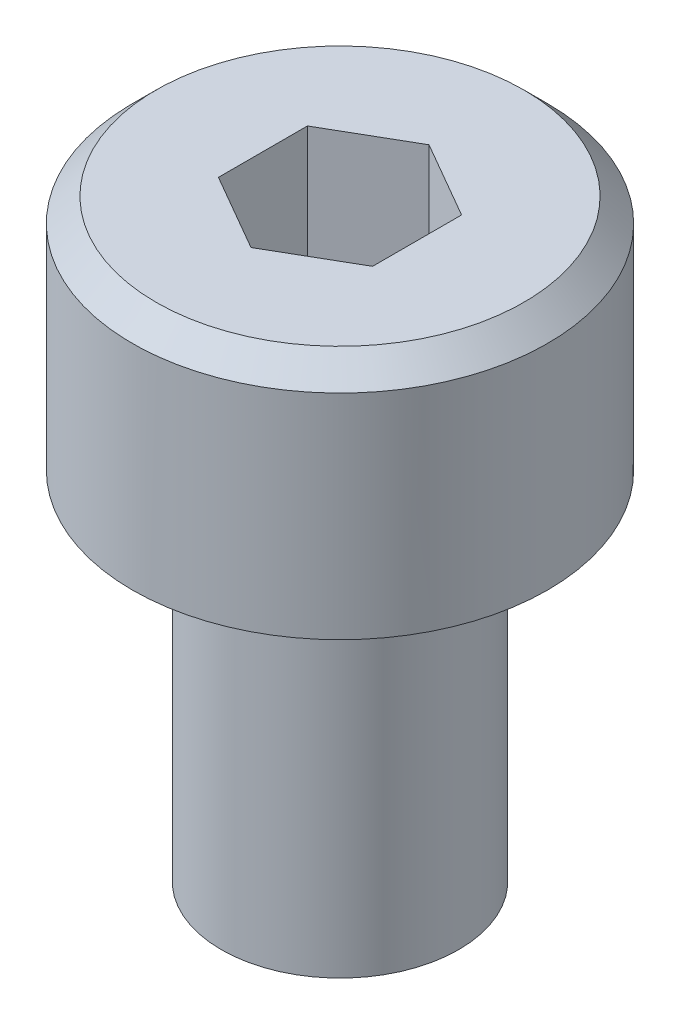
ISO-10303-21;
HEADER;
FILE_DESCRIPTION(('STEP AP214'),'2;1');
FILE_NAME('part.step','',(''),(''),'','','');
FILE_SCHEMA(('AUTOMOTIVE_DESIGN { 1 0 10303 214 1 1 1 1 }'));
ENDSEC;
DATA;
#1=APPLICATION_CONTEXT('core data for automotive mechanical design processes');
#2=APPLICATION_PROTOCOL_DEFINITION('international standard','automotive_design',2000,#1);
#3=PRODUCT_CONTEXT('',#1,'mechanical');
#4=PRODUCT('Part','Part','',(#3));
#5=PRODUCT_RELATED_PRODUCT_CATEGORY('part','',(#4));
#6=PRODUCT_DEFINITION_FORMATION('','',#4);
#7=PRODUCT_DEFINITION_CONTEXT('part definition',#1,'design');
#8=PRODUCT_DEFINITION('design','',#6,#7);
#9=PRODUCT_DEFINITION_SHAPE('','',#8);
#10=(LENGTH_UNIT() NAMED_UNIT(*) SI_UNIT(.MILLI.,.METRE.));
#11=(NAMED_UNIT(*) PLANE_ANGLE_UNIT() SI_UNIT($,.RADIAN.));
#12=(NAMED_UNIT(*) SI_UNIT($,.STERADIAN.) SOLID_ANGLE_UNIT());
#13=UNCERTAINTY_MEASURE_WITH_UNIT(LENGTH_MEASURE(1.E-05),#10,'distance_accuracy_value','');
#14=(GEOMETRIC_REPRESENTATION_CONTEXT(3) GLOBAL_UNCERTAINTY_ASSIGNED_CONTEXT((#13)) GLOBAL_UNIT_ASSIGNED_CONTEXT((#10,
#11,#12)) REPRESENTATION_CONTEXT('',''));
#15=CARTESIAN_POINT('',(0.,0.,0.));
#16=DIRECTION('',(0.,0.,1.));
#17=DIRECTION('',(1.,0.,0.));
#18=AXIS2_PLACEMENT_3D('',#15,#16,#17);
#19=CARTESIAN_POINT('',(0.,0.,0.));
#20=DIRECTION('',(0.,1.,0.));
#21=DIRECTION('',(0.,0.,1.));
#22=AXIS2_PLACEMENT_3D('',#19,#20,#21);
#23=PLANE('',#22);
#24=CARTESIAN_POINT('',(0.,0.,0.));
#25=DIRECTION('',(0.,1.,0.));
#26=DIRECTION('',(0.,0.,1.));
#27=AXIS2_PLACEMENT_3D('',#24,#25,#26);
#28=CIRCLE('',#27,3.5);
#29=CARTESIAN_POINT('',(0.,0.,3.5));
#30=VERTEX_POINT('',#29);
#31=EDGE_CURVE('E192',#30,#30,#28,.T.);
#32=ORIENTED_EDGE('',*,*,#31,.F.);
#33=EDGE_LOOP('',(#32));
#34=FACE_BOUND('',#33,.T.);
#35=CARTESIAN_POINT('',(0.,0.,0.));
#36=DIRECTION('',(0.,1.,0.));
#37=DIRECTION('',(0.,0.,1.));
#38=AXIS2_PLACEMENT_3D('',#35,#36,#37);
#39=CIRCLE('',#38,2.);
#40=CARTESIAN_POINT('',(0.,0.,2.));
#41=VERTEX_POINT('',#40);
#42=EDGE_CURVE('E11',#41,#41,#39,.F.);
#43=ORIENTED_EDGE('',*,*,#42,.F.);
#44=EDGE_LOOP('',(#43));
#45=FACE_BOUND('',#44,.T.);
#46=ADVANCED_FACE('F32',(#34,#45),#23,.F.);
#47=CARTESIAN_POINT('',(0.,4.,0.));
#48=DIRECTION('',(0.,1.,0.));
#49=DIRECTION('',(0.,0.,1.));
#50=AXIS2_PLACEMENT_3D('',#47,#48,#49);
#51=PLANE('',#50);
#52=CARTESIAN_POINT('',(0.,4.,0.));
#53=DIRECTION('',(0.,1.,0.));
#54=DIRECTION('',(0.,0.,1.));
#55=AXIS2_PLACEMENT_3D('',#52,#53,#54);
#56=CIRCLE('',#55,3.1);
#57=CARTESIAN_POINT('',(0.,4.,-3.1));
#58=VERTEX_POINT('',#57);
#59=EDGE_CURVE('E105',#58,#58,#56,.T.);
#60=ORIENTED_EDGE('',*,*,#59,.T.);
#61=EDGE_LOOP('',(#60));
#62=FACE_BOUND('',#61,.T.);
#63=DIRECTION('',(-0.866025403784439,0.,0.5));
#64=VECTOR('',#63,1.);
#65=CARTESIAN_POINT('',(0.,4.,-1.5));
#66=LINE('',#65,#64);
#67=CARTESIAN_POINT('',(0.,4.,-1.5));
#68=VERTEX_POINT('',#67);
#69=CARTESIAN_POINT('',(-1.29903810567666,4.,-0.75));
#70=VERTEX_POINT('',#69);
#71=EDGE_CURVE('E168',#68,#70,#66,.T.);
#72=ORIENTED_EDGE('',*,*,#71,.F.);
#73=DIRECTION('',(-0.866025403784439,0.,-0.5));
#74=VECTOR('',#73,1.);
#75=CARTESIAN_POINT('',(1.29903810567666,4.,-0.750000000000001));
#76=LINE('',#75,#74);
#77=CARTESIAN_POINT('',(1.29903810567666,4.,-0.750000000000001));
#78=VERTEX_POINT('',#77);
#79=EDGE_CURVE('E166',#78,#68,#76,.T.);
#80=ORIENTED_EDGE('',*,*,#79,.F.);
#81=DIRECTION('',(0.,0.,-1.));
#82=VECTOR('',#81,1.);
#83=CARTESIAN_POINT('',(1.29903810567666,4.,0.75));
#84=LINE('',#83,#82);
#85=CARTESIAN_POINT('',(1.29903810567666,4.,0.75));
#86=VERTEX_POINT('',#85);
#87=EDGE_CURVE('E177',#86,#78,#84,.T.);
#88=ORIENTED_EDGE('',*,*,#87,.F.);
#89=DIRECTION('',(0.866025403784439,0.,-0.5));
#90=VECTOR('',#89,1.);
#91=CARTESIAN_POINT('',(0.,4.,1.5));
#92=LINE('',#91,#90);
#93=CARTESIAN_POINT('',(0.,4.,1.5));
#94=VERTEX_POINT('',#93);
#95=EDGE_CURVE('E174',#94,#86,#92,.T.);
#96=ORIENTED_EDGE('',*,*,#95,.F.);
#97=DIRECTION('',(0.866025403784439,0.,0.5));
#98=VECTOR('',#97,1.);
#99=CARTESIAN_POINT('',(-1.29903810567666,4.,0.75));
#100=LINE('',#99,#98);
#101=CARTESIAN_POINT('',(-1.29903810567666,4.,0.75));
#102=VERTEX_POINT('',#101);
#103=EDGE_CURVE('E172',#102,#94,#100,.T.);
#104=ORIENTED_EDGE('',*,*,#103,.F.);
#105=DIRECTION('',(0.,0.,1.));
#106=VECTOR('',#105,1.);
#107=CARTESIAN_POINT('',(-1.29903810567666,4.,-0.75));
#108=LINE('',#107,#106);
#109=EDGE_CURVE('E170',#70,#102,#108,.T.);
#110=ORIENTED_EDGE('',*,*,#109,.F.);
#111=EDGE_LOOP('',(#72,#80,#88,#96,#104,#110));
#112=FACE_BOUND('',#111,.T.);
#113=ADVANCED_FACE('F160',(#62,#112),#51,.T.);
#114=CARTESIAN_POINT('',(0.,4.,0.));
#115=DIRECTION('',(0.,-1.,0.));
#116=DIRECTION('',(0.,0.,-1.));
#117=AXIS2_PLACEMENT_3D('',#114,#115,#116);
#118=CYLINDRICAL_SURFACE('',#117,3.5);
#119=CARTESIAN_POINT('',(0.,3.6,0.));
#120=DIRECTION('',(0.,1.,0.));
#121=DIRECTION('',(0.,0.,1.));
#122=AXIS2_PLACEMENT_3D('',#119,#120,#121);
#123=CIRCLE('',#122,3.5);
#124=CARTESIAN_POINT('',(0.,3.6,-3.5));
#125=VERTEX_POINT('',#124);
#126=EDGE_CURVE('E103',#125,#125,#123,.F.);
#127=ORIENTED_EDGE('',*,*,#126,.T.);
#128=EDGE_LOOP('',(#127));
#129=FACE_BOUND('',#128,.T.);
#130=ORIENTED_EDGE('',*,*,#31,.T.);
#131=EDGE_LOOP('',(#130));
#132=FACE_BOUND('',#131,.T.);
#133=ADVANCED_FACE('F158',(#129,#132),#118,.T.);
#134=CARTESIAN_POINT('',(1.29903810567666,4.,-0.750000000000001));
#135=DIRECTION('',(-0.5,0.,0.866025403784439));
#136=DIRECTION('',(0.866025403784439,0.,0.5));
#137=AXIS2_PLACEMENT_3D('',#134,#135,#136);
#138=PLANE('',#137);
#139=CARTESIAN_POINT('',(1.29923810567666,2.00006667436408,-0.749884529946163));
#140=CARTESIAN_POINT('',(1.24214987270278,1.98102739698028,-0.78284443662119));
#141=CARTESIAN_POINT('',(1.18456886238507,1.96371133437114,-0.816088848428332));
#142=CARTESIAN_POINT('',(1.06840958998256,1.93348474770639,-0.883153435618794));
#143=CARTESIAN_POINT('',(1.00982926260591,1.92058491882438,-0.916974803398919));
#144=CARTESIAN_POINT('',(0.893394665878013,1.90050277895804,-0.984198349162754));
#145=CARTESIAN_POINT('',(0.835558320207964,1.89318683914949,-1.0175901789043));
#146=CARTESIAN_POINT('',(0.719613235026872,1.8844502272376,-1.08453110504482));
#147=CARTESIAN_POINT('',(0.661504917460321,1.88302232353665,-1.11807995783402));
#148=CARTESIAN_POINT('',(0.552909399162213,1.88597941688018,-1.18077760955622));
#149=CARTESIAN_POINT('',(0.502406011990167,1.88963834315006,-1.20993575373499));
#150=CARTESIAN_POINT('',(0.401728295544788,1.90123916970559,-1.26806206042613));
#151=CARTESIAN_POINT('',(0.351554314972344,1.90918503984658,-1.29703002161594));
#152=CARTESIAN_POINT('',(0.250668712309326,1.92905074406248,-1.35527635147079));
#153=CARTESIAN_POINT('',(0.199969870837079,1.94105485948197,-1.3845473412424));
#154=CARTESIAN_POINT('',(0.0993287188256888,1.96830011157965,-1.44265253744773));
#155=CARTESIAN_POINT('',(0.049385117088889,1.98353483895623,-1.47148748935477));
#156=CARTESIAN_POINT('',(-0.000199999999999955,2.00006667436408,-1.50011547005384));
#157=B_SPLINE_CURVE_WITH_KNOTS('',3,(#139,#140,#141,#142,#143,#144,#145,#146,#147,#148,#149,
#150,#151,#152,#153,#154,#155,#156),.UNSPECIFIED.,.F.,.F.,(4,2,2,2,2,2,2,2,4),(0.,
0.205923753300298,0.412342739320073,0.613651952864191,0.814713847677287,0.989839927834408,
1.1651284597321,1.34430720566629,1.5231337451063),.UNSPECIFIED.);
#158=CARTESIAN_POINT('',(1.29903810567666,2.,-0.75));
#159=VERTEX_POINT('',#158);
#160=CARTESIAN_POINT('',(0.,2.,-1.5));
#161=VERTEX_POINT('',#160);
#162=EDGE_CURVE('E98',#159,#161,#157,.T.);
#163=ORIENTED_EDGE('',*,*,#162,.F.);
#164=DIRECTION('',(0.,-1.,0.));
#165=VECTOR('',#164,1.);
#166=CARTESIAN_POINT('',(1.29903810567666,4.,-0.750000000000001));
#167=LINE('',#166,#165);
#168=EDGE_CURVE('E179',#78,#159,#167,.T.);
#169=ORIENTED_EDGE('',*,*,#168,.F.);
#170=ORIENTED_EDGE('',*,*,#79,.T.);
#171=DIRECTION('',(0.,-1.,0.));
#172=VECTOR('',#171,1.);
#173=CARTESIAN_POINT('',(0.,4.,-1.5));
#174=LINE('',#173,#172);
#175=EDGE_CURVE('E190',#68,#161,#174,.T.);
#176=ORIENTED_EDGE('',*,*,#175,.T.);
#177=EDGE_LOOP('',(#163,#169,#170,#176));
#178=FACE_BOUND('',#177,.T.);
#179=ADVANCED_FACE('F154',(#178),#138,.T.);
#180=CARTESIAN_POINT('',(0.,4.,-1.5));
#181=DIRECTION('',(0.5,0.,0.866025403784439));
#182=DIRECTION('',(0.866025403784439,0.,-0.5));
#183=AXIS2_PLACEMENT_3D('',#180,#181,#182);
#184=PLANE('',#183);
#185=CARTESIAN_POINT('',(0.00019999999999992,2.00006667436408,-1.50011547005384));
#186=CARTESIAN_POINT('',(-0.0568882329738765,1.98102739698028,-1.46715556337881));
#187=CARTESIAN_POINT('',(-0.114469243291589,1.96371133437114,-1.43391115157167));
#188=CARTESIAN_POINT('',(-0.230628515694101,1.93348474770639,-1.36684656438121));
#189=CARTESIAN_POINT('',(-0.289208843070752,1.92058491882438,-1.33302519660108));
#190=CARTESIAN_POINT('',(-0.405643439798644,1.90050277895804,-1.26580165083725));
#191=CARTESIAN_POINT('',(-0.463479785468694,1.89318683914949,-1.2324098210957));
#192=CARTESIAN_POINT('',(-0.579424870649785,1.8844502272376,-1.16546889495518));
#193=CARTESIAN_POINT('',(-0.637533188216337,1.88302232353665,-1.13192004216598));
#194=CARTESIAN_POINT('',(-0.746128706514445,1.88597941688018,-1.06922239044378));
#195=CARTESIAN_POINT('',(-0.79663209368649,1.88963834315006,-1.04006424626501));
#196=CARTESIAN_POINT('',(-0.89730981013187,1.90123916970559,-0.981937939573873));
#197=CARTESIAN_POINT('',(-0.947483790704314,1.90918503984658,-0.952969978384058));
#198=CARTESIAN_POINT('',(-1.04836939336733,1.92905074406248,-0.894723648529207));
#199=CARTESIAN_POINT('',(-1.09906823483958,1.94105485948197,-0.865452658757603));
#200=CARTESIAN_POINT('',(-1.19970938685097,1.96830011157965,-0.807347462552272));
#201=CARTESIAN_POINT('',(-1.24965298858777,1.98353483895623,-0.778512510645232));
#202=CARTESIAN_POINT('',(-1.29923810567666,2.00006667436408,-0.749884529946162));
#203=B_SPLINE_CURVE_WITH_KNOTS('',3,(#185,#186,#187,#188,#189,#190,#191,#192,#193,#194,#195,
#196,#197,#198,#199,#200,#201,#202),.UNSPECIFIED.,.F.,.F.,(4,2,2,2,2,2,2,2,4),(0.,
0.205923753300298,0.412342739320073,0.613651952864191,0.814713847677287,0.989839927834407,
1.1651284597321,1.34430720566629,1.5231337451063),.UNSPECIFIED.);
#204=CARTESIAN_POINT('',(-1.29903810567666,2.,-0.75));
#205=VERTEX_POINT('',#204);
#206=EDGE_CURVE('E47',#161,#205,#203,.T.);
#207=ORIENTED_EDGE('',*,*,#206,.F.);
#208=ORIENTED_EDGE('',*,*,#175,.F.);
#209=ORIENTED_EDGE('',*,*,#71,.T.);
#210=DIRECTION('',(0.,-1.,0.));
#211=VECTOR('',#210,1.);
#212=CARTESIAN_POINT('',(-1.29903810567666,4.,-0.75));
#213=LINE('',#212,#211);
#214=EDGE_CURVE('E188',#70,#205,#213,.T.);
#215=ORIENTED_EDGE('',*,*,#214,.T.);
#216=EDGE_LOOP('',(#207,#208,#209,#215));
#217=FACE_BOUND('',#216,.T.);
#218=ADVANCED_FACE('F150',(#217),#184,.T.);
#219=CARTESIAN_POINT('',(-1.29903810567666,4.,-0.75));
#220=DIRECTION('',(1.,0.,0.));
#221=DIRECTION('',(0.,0.,-1.));
#222=AXIS2_PLACEMENT_3D('',#219,#220,#221);
#223=PLANE('',#222);
#224=CARTESIAN_POINT('',(-1.29903810567666,2.4830282094431,-1.94225048695755));
#225=CARTESIAN_POINT('',(-1.29903810567666,2.45611497443675,-1.88615347064013));
#226=CARTESIAN_POINT('',(-1.29903810567666,2.42948135054686,-1.82991990971891));
#227=CARTESIAN_POINT('',(-1.29903810567666,2.37693176598375,-1.71710663219018));
#228=CARTESIAN_POINT('',(-1.29903810567666,2.35101593446546,-1.66052685549438));
#229=CARTESIAN_POINT('',(-1.29903810567666,2.29991559584203,-1.54662366716242));
#230=CARTESIAN_POINT('',(-1.29903810567666,2.27473647859602,-1.48929782656429));
#231=CARTESIAN_POINT('',(-1.29903810567666,2.2255078925688,-1.37416603649638));
#232=CARTESIAN_POINT('',(-1.29903810567666,2.20145836505076,-1.31636011217452));
#233=CARTESIAN_POINT('',(-1.29903810567666,2.15417463668968,-1.19864930460941));
#234=CARTESIAN_POINT('',(-1.29903810567666,2.13097818335424,-1.13872905416261));
#235=CARTESIAN_POINT('',(-1.29903810567666,2.08652162979831,-1.01817680082139));
#236=CARTESIAN_POINT('',(-1.29903810567666,2.06526177221582,-0.957544709811161));
#237=CARTESIAN_POINT('',(-1.29903810567666,2.00528369487247,-0.774679321912285));
#238=CARTESIAN_POINT('',(-1.29903810567666,1.97022627007519,-0.651142266759561));
#239=CARTESIAN_POINT('',(-1.29903810567666,1.92956138055463,-0.463364900845992));
#240=CARTESIAN_POINT('',(-1.29903810567666,1.91799854238455,-0.400420390287828));
#241=CARTESIAN_POINT('',(-1.29903810567666,1.89963928010999,-0.273823298675913));
#242=CARTESIAN_POINT('',(-1.29903810567666,1.89284253390381,-0.210170765767089));
#243=CARTESIAN_POINT('',(-1.29903810567666,1.88464414943077,-0.0832760814164118));
#244=CARTESIAN_POINT('',(-1.29903810567666,1.88317884506845,-0.0200381507832169));
#245=CARTESIAN_POINT('',(-1.29903810567666,1.88559754660934,0.106333266063468));
#246=CARTESIAN_POINT('',(-1.29903810567666,1.88948188374344,0.169466745567383));
#247=CARTESIAN_POINT('',(-1.29903810567666,1.90532405359351,0.325239234546665));
#248=CARTESIAN_POINT('',(-1.29903810567666,1.92025075011812,0.417576377050972));
#249=CARTESIAN_POINT('',(-1.29903810567666,1.95874239355456,0.600455056286723));
#250=CARTESIAN_POINT('',(-1.29903810567666,1.98231775163072,0.690994289665581));
#251=CARTESIAN_POINT('',(-1.29903810567666,2.02259022438996,0.82640566883731));
#252=CARTESIAN_POINT('',(-1.29903810567666,2.0370204504804,0.871977772356621));
#253=CARTESIAN_POINT('',(-1.29903810567666,2.06721578122061,0.96264760340618));
#254=CARTESIAN_POINT('',(-1.29903810567666,2.08298005280305,1.00774560749938));
#255=CARTESIAN_POINT('',(-1.29903810567666,2.11561453093579,1.09752750677854));
#256=CARTESIAN_POINT('',(-1.29903810567666,2.13248453649953,1.14221147554661));
#257=CARTESIAN_POINT('',(-1.29903810567666,2.16714800641459,1.23122731862912));
#258=CARTESIAN_POINT('',(-1.29903810567666,2.18494162678785,1.27555913198762));
#259=CARTESIAN_POINT('',(-1.29903810567666,2.23150045860955,1.38871805704584));
#260=CARTESIAN_POINT('',(-1.29903810567666,2.26081501435599,1.45731890114295));
#261=CARTESIAN_POINT('',(-1.29903810567666,2.32085725909891,1.59390109839042));
#262=CARTESIAN_POINT('',(-1.29903810567666,2.35158505395942,1.66188240467344));
#263=CARTESIAN_POINT('',(-1.29903810567666,2.44539011368129,1.86510344552369));
#264=CARTESIAN_POINT('',(-1.29903810567666,2.510079436759,1.99959760210747));
#265=CARTESIAN_POINT('',(-1.29903810567666,2.64217114209873,2.26743688758764));
#266=CARTESIAN_POINT('',(-1.29903810567666,2.70957676187852,2.40078040067516));
#267=CARTESIAN_POINT('',(-1.29903810567666,2.84612121611795,2.66655383264073));
#268=CARTESIAN_POINT('',(-1.29903810567666,2.91525983026838,2.79898386494403));
#269=CARTESIAN_POINT('',(-1.29903810567666,3.04814885601528,3.05074184410149));
#270=CARTESIAN_POINT('',(-1.29903810567666,3.11179190110218,3.17012666108495));
#271=CARTESIAN_POINT('',(-1.29903810567666,3.23980313725268,3.40851226994163));
#272=CARTESIAN_POINT('',(-1.29903810567666,3.30417135515214,3.52751304739197));
#273=CARTESIAN_POINT('',(-1.29903810567666,3.43328666949576,3.7649164236608));
#274=CARTESIAN_POINT('',(-1.29903810567666,3.4980323858165,3.88331977408368));
#275=CARTESIAN_POINT('',(-1.29903810567666,3.62794521812164,4.11988709223021));
#276=CARTESIAN_POINT('',(-1.29903810567666,3.69311231187584,4.23805107215707));
#277=CARTESIAN_POINT('',(-1.29903810567666,3.75843392563826,4.35612905173637));
#278=B_SPLINE_CURVE_WITH_KNOTS('',3,(#224,#225,#226,#227,#228,#229,#230,#231,#232,#233,#234,
#235,#236,#237,#238,#239,#240,#241,#242,#243,#244,#245,#246,#247,#248,#249,#250,#251,#252,#253,
#254,#255,#256,#257,#258,#259,#260,#261,#262,#263,#264,#265,#266,#267,#268,#269,#270,#271,#272,
#273,#274,#275,#276,#277),.UNSPECIFIED.,.F.,.F.,(4,2,2,2,2,2,2,2,2,2,2,2,2,2,2,2,2,2,2,2,2,2,2,
2,2,2,4),(0.,0.186659228852257,0.373351828596217,0.561176912269828,0.748992218507678,
0.941717183202198,1.13446626147998,1.51887707501251,1.71072463225552,1.90255922282029,
2.0920953352963,2.28164318370651,2.56167506258581,2.84204515290936,2.98543589028851,
3.12873773647356,3.27201360688425,3.41531375948927,3.63909589056128,3.86289481227248,
4.31056657509818,4.75878868031947,5.20695409084657,5.61281889959598,6.01869877750684,
6.4235462869597,6.82837260973074),.UNSPECIFIED.);
#279=CARTESIAN_POINT('',(-1.29903810567666,2.,0.75));
#280=VERTEX_POINT('',#279);
#281=EDGE_CURVE('E55',#205,#280,#278,.T.);
#282=ORIENTED_EDGE('',*,*,#281,.F.);
#283=ORIENTED_EDGE('',*,*,#214,.F.);
#284=ORIENTED_EDGE('',*,*,#109,.T.);
#285=DIRECTION('',(0.,-1.,0.));
#286=VECTOR('',#285,1.);
#287=CARTESIAN_POINT('',(-1.29903810567666,4.,0.75));
#288=LINE('',#287,#286);
#289=EDGE_CURVE('E186',#102,#280,#288,.T.);
#290=ORIENTED_EDGE('',*,*,#289,.T.);
#291=EDGE_LOOP('',(#282,#283,#284,#290));
#292=FACE_BOUND('',#291,.T.);
#293=ADVANCED_FACE('F147',(#292),#223,.T.);
#294=CARTESIAN_POINT('',(-1.29903810567666,4.,0.75));
#295=DIRECTION('',(0.5,0.,-0.866025403784439));
#296=DIRECTION('',(-0.866025403784439,0.,-0.5));
#297=AXIS2_PLACEMENT_3D('',#294,#295,#296);
#298=PLANE('',#297);
#299=CARTESIAN_POINT('',(-1.29923810567666,2.00006667436408,0.749884529946162));
#300=CARTESIAN_POINT('',(-1.24214987270278,1.98102739698028,0.78284443662119));
#301=CARTESIAN_POINT('',(-1.18456886238507,1.96371133437114,0.816088848428332));
#302=CARTESIAN_POINT('',(-1.06840958998256,1.93348474770639,0.883153435618793));
#303=CARTESIAN_POINT('',(-1.00982926260591,1.92058491882438,0.916974803398919));
#304=CARTESIAN_POINT('',(-0.893394665878014,1.90050277895804,0.984198349162753));
#305=CARTESIAN_POINT('',(-0.835558320207964,1.89318683914949,1.0175901789043));
#306=CARTESIAN_POINT('',(-0.719613235026873,1.8844502272376,1.08453110504482));
#307=CARTESIAN_POINT('',(-0.661504917460321,1.88302232353665,1.11807995783402));
#308=CARTESIAN_POINT('',(-0.552909399162214,1.88597941688018,1.18077760955622));
#309=CARTESIAN_POINT('',(-0.502406011990168,1.88963834315006,1.20993575373499));
#310=CARTESIAN_POINT('',(-0.401728295544788,1.90123916970559,1.26806206042613));
#311=CARTESIAN_POINT('',(-0.351554314972344,1.90918503984658,1.29703002161594));
#312=CARTESIAN_POINT('',(-0.250668712309326,1.92905074406248,1.35527635147079));
#313=CARTESIAN_POINT('',(-0.19996987083708,1.94105485948197,1.3845473412424));
#314=CARTESIAN_POINT('',(-0.0993287188256888,1.96830011157965,1.44265253744773));
#315=CARTESIAN_POINT('',(-0.0493851170888888,1.98353483895623,1.47148748935477));
#316=CARTESIAN_POINT('',(0.000200000000000236,2.00006667436408,1.50011547005384));
#317=B_SPLINE_CURVE_WITH_KNOTS('',3,(#299,#300,#301,#302,#303,#304,#305,#306,#307,#308,#309,
#310,#311,#312,#313,#314,#315,#316),.UNSPECIFIED.,.F.,.F.,(4,2,2,2,2,2,2,2,4),(0.,
0.205923753300298,0.412342739320072,0.61365195286419,0.814713847677287,0.989839927834407,
1.1651284597321,1.34430720566629,1.5231337451063),.UNSPECIFIED.);
#318=CARTESIAN_POINT('',(0.,2.,1.5));
#319=VERTEX_POINT('',#318);
#320=EDGE_CURVE('E132',#280,#319,#317,.T.);
#321=ORIENTED_EDGE('',*,*,#320,.F.);
#322=ORIENTED_EDGE('',*,*,#289,.F.);
#323=ORIENTED_EDGE('',*,*,#103,.T.);
#324=DIRECTION('',(0.,-1.,0.));
#325=VECTOR('',#324,1.);
#326=CARTESIAN_POINT('',(0.,4.,1.5));
#327=LINE('',#326,#325);
#328=EDGE_CURVE('E183',#94,#319,#327,.T.);
#329=ORIENTED_EDGE('',*,*,#328,.T.);
#330=EDGE_LOOP('',(#321,#322,#323,#329));
#331=FACE_BOUND('',#330,.T.);
#332=ADVANCED_FACE('F122',(#331),#298,.T.);
#333=CARTESIAN_POINT('',(0.,4.,1.5));
#334=DIRECTION('',(-0.5,0.,-0.866025403784439));
#335=DIRECTION('',(-0.866025403784439,0.,0.5));
#336=AXIS2_PLACEMENT_3D('',#333,#334,#335);
#337=PLANE('',#336);
#338=CARTESIAN_POINT('',(-0.000199999999999886,2.00006667436408,1.50011547005384));
#339=CARTESIAN_POINT('',(0.0568882329738764,1.98102739698028,1.46715556337881));
#340=CARTESIAN_POINT('',(0.114469243291589,1.96371133437114,1.43391115157167));
#341=CARTESIAN_POINT('',(0.230628515694101,1.93348474770639,1.36684656438121));
#342=CARTESIAN_POINT('',(0.289208843070752,1.92058491882438,1.33302519660108));
#343=CARTESIAN_POINT('',(0.405643439798644,1.90050277895804,1.26580165083725));
#344=CARTESIAN_POINT('',(0.463479785468694,1.89318683914949,1.2324098210957));
#345=CARTESIAN_POINT('',(0.579424870649786,1.8844502272376,1.16546889495518));
#346=CARTESIAN_POINT('',(0.637533188216337,1.88302232353665,1.13192004216598));
#347=CARTESIAN_POINT('',(0.746128706514445,1.88597941688018,1.06922239044378));
#348=CARTESIAN_POINT('',(0.79663209368649,1.88963834315006,1.04006424626501));
#349=CARTESIAN_POINT('',(0.89730981013187,1.90123916970559,0.981937939573873));
#350=CARTESIAN_POINT('',(0.947483790704314,1.90918503984658,0.952969978384058));
#351=CARTESIAN_POINT('',(1.04836939336733,1.92905074406248,0.894723648529207));
#352=CARTESIAN_POINT('',(1.09906823483958,1.94105485948197,0.865452658757603));
#353=CARTESIAN_POINT('',(1.19970938685097,1.96830011157965,0.807347462552273));
#354=CARTESIAN_POINT('',(1.24965298858777,1.98353483895623,0.778512510645232));
#355=CARTESIAN_POINT('',(1.29923810567666,2.00006667436408,0.749884529946163));
#356=B_SPLINE_CURVE_WITH_KNOTS('',3,(#338,#339,#340,#341,#342,#343,#344,#345,#346,#347,#348,
#349,#350,#351,#352,#353,#354,#355),.UNSPECIFIED.,.F.,.F.,(4,2,2,2,2,2,2,2,4),(0.,
0.205923753300298,0.412342739320073,0.613651952864191,0.814713847677287,0.989839927834408,
1.1651284597321,1.34430720566629,1.5231337451063),.UNSPECIFIED.);
#357=CARTESIAN_POINT('',(1.29903810567666,2.,0.75));
#358=VERTEX_POINT('',#357);
#359=EDGE_CURVE('E100',#319,#358,#356,.T.);
#360=ORIENTED_EDGE('',*,*,#359,.F.);
#361=ORIENTED_EDGE('',*,*,#328,.F.);
#362=ORIENTED_EDGE('',*,*,#95,.T.);
#363=DIRECTION('',(0.,-1.,0.));
#364=VECTOR('',#363,1.);
#365=CARTESIAN_POINT('',(1.29903810567666,4.,0.75));
#366=LINE('',#365,#364);
#367=EDGE_CURVE('E181',#86,#358,#366,.T.);
#368=ORIENTED_EDGE('',*,*,#367,.T.);
#369=EDGE_LOOP('',(#360,#361,#362,#368));
#370=FACE_BOUND('',#369,.T.);
#371=ADVANCED_FACE('F118',(#370),#337,.T.);
#372=CARTESIAN_POINT('',(1.29903810567666,4.,0.75));
#373=DIRECTION('',(-1.,0.,0.));
#374=DIRECTION('',(0.,0.,1.));
#375=AXIS2_PLACEMENT_3D('',#372,#373,#374);
#376=PLANE('',#375);
#377=CARTESIAN_POINT('',(1.29903810567666,2.48302820910785,-1.94225048625898));
#378=CARTESIAN_POINT('',(1.29903810567666,2.45611497411595,-1.88615346996543));
#379=CARTESIAN_POINT('',(1.29903810567666,2.42948135024049,-1.82991990906811));
#380=CARTESIAN_POINT('',(1.29903810567666,2.37693176570617,-1.71710663158725));
#381=CARTESIAN_POINT('',(1.29903810567666,2.35101593420223,-1.66052685491542));
#382=CARTESIAN_POINT('',(1.29903810567666,2.29991559560752,-1.54662366663188));
#383=CARTESIAN_POINT('',(1.29903810567666,2.27473647837588,-1.48929782605819));
#384=CARTESIAN_POINT('',(1.29903810567666,2.22550789237711,-1.37416603603934));
#385=CARTESIAN_POINT('',(1.29903810567666,2.20145836487317,-1.3163601117421));
#386=CARTESIAN_POINT('',(1.29903810567666,2.15417463654035,-1.19864930422769));
#387=CARTESIAN_POINT('',(1.29903810567666,2.13097818321906,-1.13872905380697));
#388=CARTESIAN_POINT('',(1.29903810567666,2.08652162969057,-1.01817680051836));
#389=CARTESIAN_POINT('',(1.29903810567666,2.06526177212135,-0.957544709534654));
#390=CARTESIAN_POINT('',(1.29903810567666,2.00528369481568,-0.774679321716058));
#391=CARTESIAN_POINT('',(1.29903810567666,1.9702262700408,-0.651142266618091));
#392=CARTESIAN_POINT('',(1.29903810567666,1.92956138054588,-0.463364900796985));
#393=CARTESIAN_POINT('',(1.29903810567666,1.91799854238337,-0.400420390275361));
#394=CARTESIAN_POINT('',(1.29903810567666,1.89963928011826,-0.273823298737295));
#395=CARTESIAN_POINT('',(1.29903810567666,1.89284253391397,-0.210170765865781));
#396=CARTESIAN_POINT('',(1.29903810567666,1.88464414943818,-0.0832760815890271));
#397=CARTESIAN_POINT('',(1.29903810567666,1.88317884507132,-0.0200381509924433));
#398=CARTESIAN_POINT('',(1.29903810567666,1.88559754659705,0.106333265781707));
#399=CARTESIAN_POINT('',(1.29903810567666,1.88948188372055,0.1694667452497));
#400=CARTESIAN_POINT('',(1.29903810567666,1.9053240535414,0.32523923417059));
#401=CARTESIAN_POINT('',(1.29903810567666,1.92025075004802,0.417576376652841));
#402=CARTESIAN_POINT('',(1.29903810567666,1.95874239344795,0.600455055845884));
#403=CARTESIAN_POINT('',(1.29903810567666,1.98231775150558,0.690994289204093));
#404=CARTESIAN_POINT('',(1.29903810567666,2.02259022423734,0.826405668344872));
#405=CARTESIAN_POINT('',(1.29903810567666,2.03702045031854,0.871977771853667));
#406=CARTESIAN_POINT('',(1.29903810567666,2.0672157810405,0.962647602882294));
#407=CARTESIAN_POINT('',(1.29903810567666,2.08298005261394,1.00774560696508));
#408=CARTESIAN_POINT('',(1.29903810567666,2.11561453072893,1.09752750622346));
#409=CARTESIAN_POINT('',(1.29903810567666,2.13248453628393,1.14221147498117));
#410=CARTESIAN_POINT('',(1.29903810567666,2.16714800618175,1.23122731804296));
#411=CARTESIAN_POINT('',(1.29903810567666,2.18494162654651,1.27555913139109));
#412=CARTESIAN_POINT('',(1.29903810567666,2.23150045835484,1.38871805644243));
#413=CARTESIAN_POINT('',(1.29903810567666,2.26081501409711,1.45731890054279));
#414=CARTESIAN_POINT('',(1.29903810567666,2.32085725883284,1.59390109779636));
#415=CARTESIAN_POINT('',(1.29903810567666,2.35158505369033,1.66188240408224));
#416=CARTESIAN_POINT('',(1.29903810567666,2.44539011340443,1.8651034449406));
#417=CARTESIAN_POINT('',(1.29903810567666,2.51007943647862,1.99959760152917));
#418=CARTESIAN_POINT('',(1.29903810567666,2.64217114181318,2.26743688701832));
#419=CARTESIAN_POINT('',(1.29903810567666,2.70957676159133,2.40078040011004));
#420=CARTESIAN_POINT('',(1.29903810567666,2.84612121582851,2.66655383208346));
#421=CARTESIAN_POINT('',(1.29903810567666,2.91525982997832,2.79898386439043));
#422=CARTESIAN_POINT('',(1.29903810567666,3.04814885572288,3.05074184355122));
#423=CARTESIAN_POINT('',(1.29903810567666,3.11179190080799,3.1701266605344));
#424=CARTESIAN_POINT('',(1.29903810567666,3.2398031369552,3.40851226939035));
#425=CARTESIAN_POINT('',(1.29903810567666,3.30417135485318,3.52751304684026));
#426=CARTESIAN_POINT('',(1.29903810567666,3.43328666919384,3.76491642310768));
#427=CARTESIAN_POINT('',(1.29903810567666,3.49803238551309,3.88331977352961));
#428=CARTESIAN_POINT('',(1.29903810567666,3.62794521781542,4.11988709167412));
#429=CARTESIAN_POINT('',(1.29903810567666,3.69311231156828,4.23805107159993));
#430=CARTESIAN_POINT('',(1.29903810567666,3.75843392532941,4.35612905117816));
#431=B_SPLINE_CURVE_WITH_KNOTS('',3,(#377,#378,#379,#380,#381,#382,#383,#384,#385,#386,#387,
#388,#389,#390,#391,#392,#393,#394,#395,#396,#397,#398,#399,#400,#401,#402,#403,#404,#405,#406,
#407,#408,#409,#410,#411,#412,#413,#414,#415,#416,#417,#418,#419,#420,#421,#422,#423,#424,#425,
#426,#427,#428,#429,#430),.UNSPECIFIED.,.F.,.F.,(4,2,2,2,2,2,2,2,2,2,2,2,2,2,2,2,2,2,2,2,2,2,2,
2,2,2,4),(0.,0.186659228768941,0.37335182842957,0.561176912018724,0.748992218172123,
0.941717182778375,1.13446626096786,1.51887707432482,1.71072463145617,1.90255922190943,
2.09209533427636,2.28164318257739,2.56167506138284,2.84204515163233,2.98543588897303,
3.12873773511965,3.272013605492,3.41531375805865,3.63909588913468,3.86289481084993,
4.31056657368391,4.75878867891419,5.20695408945017,5.61281889819628,6.01869877610386,
6.42354628555205,6.82837260831839),.UNSPECIFIED.);
#432=EDGE_CURVE('E40',#358,#159,#431,.F.);
#433=ORIENTED_EDGE('',*,*,#432,.F.);
#434=ORIENTED_EDGE('',*,*,#367,.F.);
#435=ORIENTED_EDGE('',*,*,#87,.T.);
#436=ORIENTED_EDGE('',*,*,#168,.T.);
#437=EDGE_LOOP('',(#433,#434,#435,#436));
#438=FACE_BOUND('',#437,.T.);
#439=ADVANCED_FACE('F114',(#438),#376,.T.);
#440=CARTESIAN_POINT('',(0.,4.,0.));
#441=DIRECTION('',(0.,-1.,0.));
#442=DIRECTION('',(0.,0.,-1.));
#443=AXIS2_PLACEMENT_3D('',#440,#441,#442);
#444=CONICAL_SURFACE('',#443,3.1,0.785398163397446);
#445=CARTESIAN_POINT('',(0.,3.6,-3.5));
#446=CARTESIAN_POINT('',(0.,3.60416666666667,-3.49583333333333));
#447=CARTESIAN_POINT('',(0.,3.60833333333333,-3.49166666666667));
#448=CARTESIAN_POINT('',(0.,3.61666666666667,-3.48333333333333));
#449=CARTESIAN_POINT('',(0.,3.62083333333333,-3.47916666666667));
#450=CARTESIAN_POINT('',(0.,3.62916666666667,-3.47083333333333));
#451=CARTESIAN_POINT('',(0.,3.63333333333333,-3.46666666666667));
#452=CARTESIAN_POINT('',(0.,3.64166666666667,-3.45833333333333));
#453=CARTESIAN_POINT('',(0.,3.64583333333333,-3.45416666666667));
#454=CARTESIAN_POINT('',(0.,3.65416666666667,-3.44583333333333));
#455=CARTESIAN_POINT('',(0.,3.65833333333333,-3.44166666666667));
#456=CARTESIAN_POINT('',(0.,3.66666666666667,-3.43333333333333));
#457=CARTESIAN_POINT('',(0.,3.67083333333333,-3.42916666666667));
#458=CARTESIAN_POINT('',(0.,3.67916666666667,-3.42083333333333));
#459=CARTESIAN_POINT('',(0.,3.68333333333333,-3.41666666666667));
#460=CARTESIAN_POINT('',(0.,3.69166666666667,-3.40833333333333));
#461=CARTESIAN_POINT('',(0.,3.69583333333333,-3.40416666666667));
#462=CARTESIAN_POINT('',(0.,3.70416666666667,-3.39583333333333));
#463=CARTESIAN_POINT('',(0.,3.70833333333333,-3.39166666666667));
#464=CARTESIAN_POINT('',(0.,3.71666666666667,-3.38333333333334));
#465=CARTESIAN_POINT('',(0.,3.72083333333333,-3.37916666666667));
#466=CARTESIAN_POINT('',(0.,3.72916666666667,-3.37083333333333));
#467=CARTESIAN_POINT('',(0.,3.73333333333333,-3.36666666666667));
#468=CARTESIAN_POINT('',(0.,3.74166666666667,-3.35833333333334));
#469=CARTESIAN_POINT('',(0.,3.74583333333333,-3.35416666666667));
#470=CARTESIAN_POINT('',(0.,3.75416666666667,-3.34583333333333));
#471=CARTESIAN_POINT('',(0.,3.75833333333333,-3.34166666666667));
#472=CARTESIAN_POINT('',(0.,3.76666666666667,-3.33333333333334));
#473=CARTESIAN_POINT('',(0.,3.77083333333333,-3.32916666666667));
#474=CARTESIAN_POINT('',(0.,3.77916666666667,-3.32083333333334));
#475=CARTESIAN_POINT('',(0.,3.78333333333333,-3.31666666666667));
#476=CARTESIAN_POINT('',(0.,3.79166666666667,-3.30833333333334));
#477=CARTESIAN_POINT('',(0.,3.79583333333333,-3.30416666666667));
#478=CARTESIAN_POINT('',(0.,3.80416666666667,-3.29583333333334));
#479=CARTESIAN_POINT('',(0.,3.80833333333333,-3.29166666666667));
#480=CARTESIAN_POINT('',(0.,3.81666666666667,-3.28333333333334));
#481=CARTESIAN_POINT('',(0.,3.82083333333333,-3.27916666666667));
#482=CARTESIAN_POINT('',(0.,3.82916666666667,-3.27083333333334));
#483=CARTESIAN_POINT('',(0.,3.83333333333333,-3.26666666666667));
#484=CARTESIAN_POINT('',(0.,3.84166666666667,-3.25833333333334));
#485=CARTESIAN_POINT('',(0.,3.84583333333333,-3.25416666666667));
#486=CARTESIAN_POINT('',(0.,3.85416666666667,-3.24583333333334));
#487=CARTESIAN_POINT('',(0.,3.85833333333333,-3.24166666666667));
#488=CARTESIAN_POINT('',(0.,3.86666666666667,-3.23333333333334));
#489=CARTESIAN_POINT('',(0.,3.87083333333333,-3.22916666666667));
#490=CARTESIAN_POINT('',(0.,3.87916666666667,-3.22083333333334));
#491=CARTESIAN_POINT('',(0.,3.88333333333333,-3.21666666666667));
#492=CARTESIAN_POINT('',(0.,3.89166666666667,-3.20833333333334));
#493=CARTESIAN_POINT('',(0.,3.89583333333333,-3.20416666666667));
#494=CARTESIAN_POINT('',(0.,3.90416666666667,-3.19583333333334));
#495=CARTESIAN_POINT('',(0.,3.90833333333333,-3.19166666666667));
#496=CARTESIAN_POINT('',(0.,3.91666666666667,-3.18333333333334));
#497=CARTESIAN_POINT('',(0.,3.92083333333333,-3.17916666666667));
#498=CARTESIAN_POINT('',(0.,3.92916666666667,-3.17083333333334));
#499=CARTESIAN_POINT('',(0.,3.93333333333333,-3.16666666666667));
#500=CARTESIAN_POINT('',(0.,3.94166666666667,-3.15833333333334));
#501=CARTESIAN_POINT('',(0.,3.94583333333333,-3.15416666666667));
#502=CARTESIAN_POINT('',(0.,3.95416666666667,-3.14583333333334));
#503=CARTESIAN_POINT('',(0.,3.95833333333333,-3.14166666666667));
#504=CARTESIAN_POINT('',(0.,3.96666666666667,-3.13333333333334));
#505=CARTESIAN_POINT('',(0.,3.97083333333333,-3.12916666666667));
#506=CARTESIAN_POINT('',(0.,3.97916666666667,-3.12083333333334));
#507=CARTESIAN_POINT('',(0.,3.98333333333333,-3.11666666666667));
#508=CARTESIAN_POINT('',(0.,3.99166666666667,-3.10833333333334));
#509=CARTESIAN_POINT('',(0.,3.99583333333333,-3.10416666666667));
#510=CARTESIAN_POINT('',(0.,4.,-3.1));
#511=B_SPLINE_CURVE_WITH_KNOTS('',3,(#445,#446,#447,#448,#449,#450,#451,#452,#453,#454,#455,
#456,#457,#458,#459,#460,#461,#462,#463,#464,#465,#466,#467,#468,#469,#470,#471,#472,#473,#474,
#475,#476,#477,#478,#479,#480,#481,#482,#483,#484,#485,#486,#487,#488,#489,#490,#491,#492,#493,
#494,#495,#496,#497,#498,#499,#500,#501,#502,#503,#504,#505,#506,#507,#508,#509,#510),
.UNSPECIFIED.,.F.,.F.,(4,2,2,2,2,2,2,2,2,2,2,2,2,2,2,2,2,2,2,2,2,2,2,2,2,2,2,2,2,2,2,2,4),(0.,
0.0176776695296636,0.0353553390593275,0.0530330085889907,0.0707106781186546,0.0883883476483182,
0.106066017177982,0.123743686707645,0.141421356237309,0.159099025766972,0.176776695296636,
0.194454364826299,0.212132034355963,0.229809703885627,0.24748737341529,0.265165042944954,
0.282842712474617,0.300520382004281,0.318198051533944,0.335875721063608,0.353553390593271,
0.371231060122935,0.388908729652599,0.406586399182263,0.424264068711926,0.44194173824159,
0.459619407771253,0.477297077300917,0.49497474683058,0.512652416360244,0.530330085889907,
0.548007755419571,0.565685424949235),.UNSPECIFIED.);
#512=EDGE_CURVE('BSEAM34',#125,#58,#511,.T.);
#513=ORIENTED_EDGE('',*,*,#126,.F.);
#514=ORIENTED_EDGE('',*,*,#59,.F.);
#515=ORIENTED_EDGE('',*,*,#512,.T.);
#516=ORIENTED_EDGE('',*,*,#512,.F.);
#517=EDGE_LOOP('',(#513,#515,#514,#516));
#518=FACE_BOUND('',#517,.T.);
#519=ADVANCED_FACE('F34',(#518),#444,.T.);
#520=CARTESIAN_POINT('',(0.,2.,0.));
#521=DIRECTION('',(0.,1.,0.));
#522=DIRECTION('',(-1.,0.,0.));
#523=AXIS2_PLACEMENT_3D('',#520,#521,#522);
#524=CONICAL_SURFACE('',#523,1.5,1.0471975511966);
#525=CARTESIAN_POINT('',(0.,1.13397459621557,0.));
#526=VERTEX_POINT('',#525);
#527=VERTEX_LOOP('',#526);
#528=FACE_BOUND('',#527,.T.);
#529=ORIENTED_EDGE('',*,*,#432,.T.);
#530=ORIENTED_EDGE('',*,*,#162,.T.);
#531=ORIENTED_EDGE('',*,*,#206,.T.);
#532=ORIENTED_EDGE('',*,*,#281,.T.);
#533=ORIENTED_EDGE('',*,*,#320,.T.);
#534=ORIENTED_EDGE('',*,*,#359,.T.);
#535=EDGE_LOOP('',(#529,#530,#531,#532,#533,#534));
#536=FACE_BOUND('',#535,.T.);
#537=ADVANCED_FACE('F89',(#528,#536),#524,.F.);
#538=CARTESIAN_POINT('',(0.,-6.,0.));
#539=DIRECTION('',(0.,1.,0.));
#540=DIRECTION('',(0.,0.,1.));
#541=AXIS2_PLACEMENT_3D('',#538,#539,#540);
#542=CYLINDRICAL_SURFACE('',#541,2.);
#543=CARTESIAN_POINT('',(0.,-6.,0.));
#544=DIRECTION('',(0.,-1.,0.));
#545=DIRECTION('',(0.,0.,-1.));
#546=AXIS2_PLACEMENT_3D('',#543,#544,#545);
#547=CIRCLE('',#546,2.);
#548=CARTESIAN_POINT('',(0.,-6.,-2.));
#549=VERTEX_POINT('',#548);
#550=EDGE_CURVE('E133',#549,#549,#547,.T.);
#551=ORIENTED_EDGE('',*,*,#550,.F.);
#552=EDGE_LOOP('',(#551));
#553=FACE_BOUND('',#552,.T.);
#554=ORIENTED_EDGE('',*,*,#42,.T.);
#555=EDGE_LOOP('',(#554));
#556=FACE_BOUND('',#555,.T.);
#557=ADVANCED_FACE('F92',(#553,#556),#542,.T.);
#558=CARTESIAN_POINT('',(0.,-6.,0.));
#559=DIRECTION('',(0.,-1.,0.));
#560=DIRECTION('',(0.,0.,-1.));
#561=AXIS2_PLACEMENT_3D('',#558,#559,#560);
#562=PLANE('',#561);
#563=ORIENTED_EDGE('',*,*,#550,.T.);
#564=EDGE_LOOP('',(#563));
#565=FACE_BOUND('',#564,.T.);
#566=ADVANCED_FACE('F265',(#565),#562,.T.);
#567=CLOSED_SHELL('',(#46,#113,#133,#179,#218,#293,#332,#371,#439,#519,#537,#557,#566));
#568=MANIFOLD_SOLID_BREP('B2',#567);
#569=ADVANCED_BREP_SHAPE_REPRESENTATION('',(#18,#568),#14);
#570=SHAPE_DEFINITION_REPRESENTATION(#9,#569);
ENDSEC;
END-ISO-10303-21;
